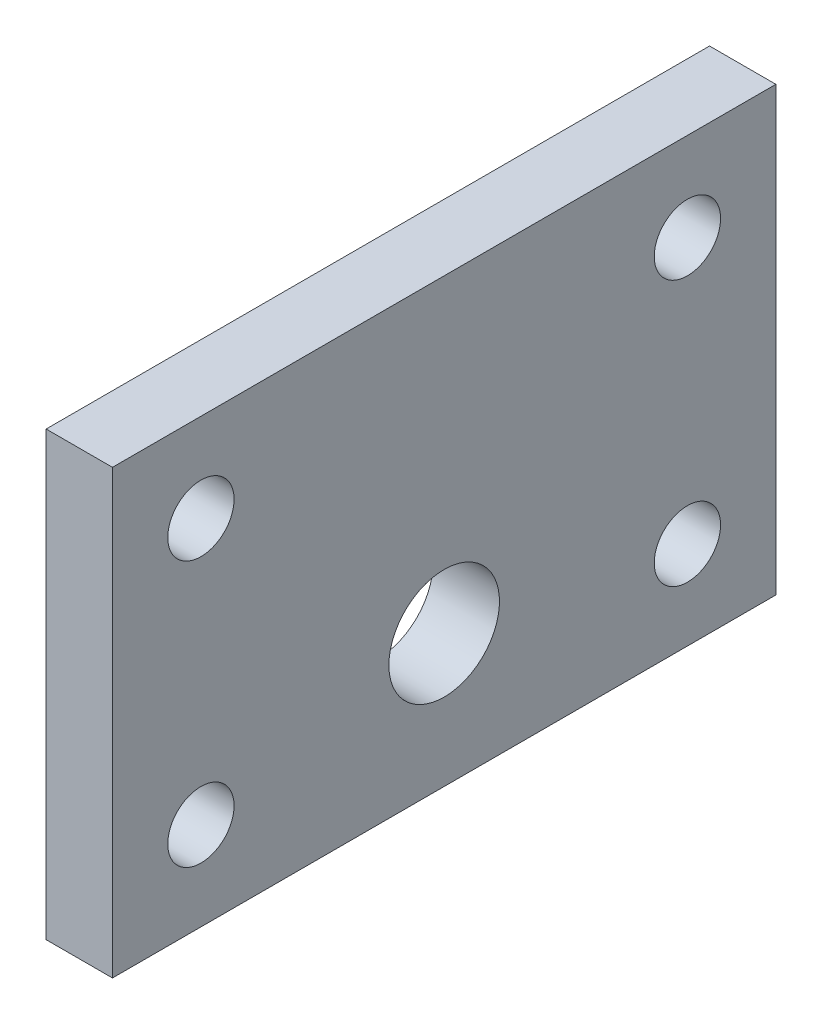
ISO-10303-21;
HEADER;
FILE_DESCRIPTION(('STEP AP214'),'2;1');
FILE_NAME('part.step','',(''),(''),'','','');
FILE_SCHEMA(('AUTOMOTIVE_DESIGN { 1 0 10303 214 1 1 1 1 }'));
ENDSEC;
DATA;
#1=APPLICATION_CONTEXT('core data for automotive mechanical design processes');
#2=APPLICATION_PROTOCOL_DEFINITION('international standard','automotive_design',2000,#1);
#3=PRODUCT_CONTEXT('',#1,'mechanical');
#4=PRODUCT('Part','Part','',(#3));
#5=PRODUCT_RELATED_PRODUCT_CATEGORY('part','',(#4));
#6=PRODUCT_DEFINITION_FORMATION('','',#4);
#7=PRODUCT_DEFINITION_CONTEXT('part definition',#1,'design');
#8=PRODUCT_DEFINITION('design','',#6,#7);
#9=PRODUCT_DEFINITION_SHAPE('','',#8);
#10=(LENGTH_UNIT() NAMED_UNIT(*) SI_UNIT(.MILLI.,.METRE.));
#11=(NAMED_UNIT(*) PLANE_ANGLE_UNIT() SI_UNIT($,.RADIAN.));
#12=(NAMED_UNIT(*) SI_UNIT($,.STERADIAN.) SOLID_ANGLE_UNIT());
#13=UNCERTAINTY_MEASURE_WITH_UNIT(LENGTH_MEASURE(1.E-05),#10,'distance_accuracy_value','');
#14=(GEOMETRIC_REPRESENTATION_CONTEXT(3) GLOBAL_UNCERTAINTY_ASSIGNED_CONTEXT((#13)) GLOBAL_UNIT_ASSIGNED_CONTEXT((#10,
#11,#12)) REPRESENTATION_CONTEXT('',''));
#15=CARTESIAN_POINT('',(0.,0.,0.));
#16=DIRECTION('',(0.,0.,1.));
#17=DIRECTION('',(1.,0.,0.));
#18=AXIS2_PLACEMENT_3D('',#15,#16,#17);
#19=CARTESIAN_POINT('',(3.,0.,0.));
#20=DIRECTION('',(1.,0.,0.));
#21=DIRECTION('',(0.,0.,-1.));
#22=AXIS2_PLACEMENT_3D('',#19,#20,#21);
#23=PLANE('',#22);
#24=CARTESIAN_POINT('',(3.,-4.,0.));
#25=DIRECTION('',(1.,0.,0.));
#26=DIRECTION('',(0.,0.,-1.));
#27=AXIS2_PLACEMENT_3D('',#24,#25,#26);
#28=CIRCLE('',#27,2.5);
#29=CARTESIAN_POINT('',(3.,-4.,2.5));
#30=VERTEX_POINT('',#29);
#31=EDGE_CURVE('E136',#30,#30,#28,.F.);
#32=ORIENTED_EDGE('',*,*,#31,.T.);
#33=EDGE_LOOP('',(#32));
#34=FACE_BOUND('',#33,.T.);
#35=CARTESIAN_POINT('',(3.,-6.,-11.));
#36=DIRECTION('',(1.,0.,0.));
#37=DIRECTION('',(0.,0.,1.));
#38=AXIS2_PLACEMENT_3D('',#35,#36,#37);
#39=CIRCLE('',#38,1.5);
#40=CARTESIAN_POINT('',(3.,-6.,-9.49999999999999));
#41=VERTEX_POINT('',#40);
#42=EDGE_CURVE('E121',#41,#41,#39,.T.);
#43=ORIENTED_EDGE('',*,*,#42,.F.);
#44=EDGE_LOOP('',(#43));
#45=FACE_BOUND('',#44,.T.);
#46=CARTESIAN_POINT('',(3.,6.,11.));
#47=DIRECTION('',(1.,0.,0.));
#48=DIRECTION('',(0.,0.,-1.));
#49=AXIS2_PLACEMENT_3D('',#46,#47,#48);
#50=CIRCLE('',#49,1.5);
#51=CARTESIAN_POINT('',(3.,6.,9.50000000000001));
#52=VERTEX_POINT('',#51);
#53=EDGE_CURVE('E100',#52,#52,#50,.T.);
#54=ORIENTED_EDGE('',*,*,#53,.F.);
#55=EDGE_LOOP('',(#54));
#56=FACE_BOUND('',#55,.T.);
#57=DIRECTION('',(0.,-1.,0.));
#58=VECTOR('',#57,1.);
#59=CARTESIAN_POINT('',(3.,-9.99999999999999,15.));
#60=LINE('',#59,#58);
#61=CARTESIAN_POINT('',(3.,9.99999999999999,15.));
#62=VERTEX_POINT('',#61);
#63=CARTESIAN_POINT('',(3.,-9.99999999999999,15.));
#64=VERTEX_POINT('',#63);
#65=EDGE_CURVE('E85',#62,#64,#60,.T.);
#66=ORIENTED_EDGE('',*,*,#65,.T.);
#67=DIRECTION('',(0.,0.,-1.));
#68=VECTOR('',#67,1.);
#69=CARTESIAN_POINT('',(3.,-10.,-15.));
#70=LINE('',#69,#68);
#71=CARTESIAN_POINT('',(3.,-10.,-15.));
#72=VERTEX_POINT('',#71);
#73=EDGE_CURVE('E80',#64,#72,#70,.T.);
#74=ORIENTED_EDGE('',*,*,#73,.T.);
#75=DIRECTION('',(0.,1.,0.));
#76=VECTOR('',#75,1.);
#77=CARTESIAN_POINT('',(3.,-10.,-15.));
#78=LINE('',#77,#76);
#79=CARTESIAN_POINT('',(3.,10.,-15.));
#80=VERTEX_POINT('',#79);
#81=EDGE_CURVE('E83',#72,#80,#78,.T.);
#82=ORIENTED_EDGE('',*,*,#81,.T.);
#83=DIRECTION('',(0.,0.,1.));
#84=VECTOR('',#83,1.);
#85=CARTESIAN_POINT('',(3.,10.,-15.));
#86=LINE('',#85,#84);
#87=EDGE_CURVE('E50',#80,#62,#86,.T.);
#88=ORIENTED_EDGE('',*,*,#87,.T.);
#89=EDGE_LOOP('',(#66,#74,#82,#88));
#90=FACE_BOUND('',#89,.T.);
#91=CARTESIAN_POINT('',(3.,-6.,11.));
#92=DIRECTION('',(1.,0.,0.));
#93=DIRECTION('',(0.,0.,-1.));
#94=AXIS2_PLACEMENT_3D('',#91,#92,#93);
#95=CIRCLE('',#94,1.5);
#96=CARTESIAN_POINT('',(3.,-6.,9.50000000000002));
#97=VERTEX_POINT('',#96);
#98=EDGE_CURVE('E115',#97,#97,#95,.T.);
#99=ORIENTED_EDGE('',*,*,#98,.F.);
#100=EDGE_LOOP('',(#99));
#101=FACE_BOUND('',#100,.T.);
#102=CARTESIAN_POINT('',(3.,6.,-11.));
#103=DIRECTION('',(1.,0.,0.));
#104=DIRECTION('',(0.,0.,1.));
#105=AXIS2_PLACEMENT_3D('',#102,#103,#104);
#106=CIRCLE('',#105,1.5);
#107=CARTESIAN_POINT('',(3.,6.,-9.49999999999998));
#108=VERTEX_POINT('',#107);
#109=EDGE_CURVE('E127',#108,#108,#106,.T.);
#110=ORIENTED_EDGE('',*,*,#109,.F.);
#111=EDGE_LOOP('',(#110));
#112=FACE_BOUND('',#111,.T.);
#113=ADVANCED_FACE('F33',(#34,#45,#56,#90,#101,#112),#23,.T.);
#114=CARTESIAN_POINT('',(0.,0.,0.));
#115=DIRECTION('',(1.,0.,0.));
#116=DIRECTION('',(0.,0.,-1.));
#117=AXIS2_PLACEMENT_3D('',#114,#115,#116);
#118=PLANE('',#117);
#119=CARTESIAN_POINT('',(0.,-4.,0.));
#120=DIRECTION('',(-1.,0.,0.));
#121=DIRECTION('',(0.,0.,1.));
#122=AXIS2_PLACEMENT_3D('',#119,#120,#121);
#123=CIRCLE('',#122,2.5);
#124=CARTESIAN_POINT('',(0.,-4.,2.5));
#125=VERTEX_POINT('',#124);
#126=EDGE_CURVE('E133',#125,#125,#123,.T.);
#127=ORIENTED_EDGE('',*,*,#126,.F.);
#128=EDGE_LOOP('',(#127));
#129=FACE_BOUND('',#128,.T.);
#130=DIRECTION('',(0.,-1.,0.));
#131=VECTOR('',#130,1.);
#132=CARTESIAN_POINT('',(0.,-9.99999999999999,15.));
#133=LINE('',#132,#131);
#134=CARTESIAN_POINT('',(0.,9.99999999999999,15.));
#135=VERTEX_POINT('',#134);
#136=CARTESIAN_POINT('',(0.,-9.99999999999999,15.));
#137=VERTEX_POINT('',#136);
#138=EDGE_CURVE('E97',#135,#137,#133,.T.);
#139=ORIENTED_EDGE('',*,*,#138,.F.);
#140=DIRECTION('',(0.,0.,1.));
#141=VECTOR('',#140,1.);
#142=CARTESIAN_POINT('',(0.,10.,-15.));
#143=LINE('',#142,#141);
#144=CARTESIAN_POINT('',(0.,10.,-15.));
#145=VERTEX_POINT('',#144);
#146=EDGE_CURVE('E73',#145,#135,#143,.T.);
#147=ORIENTED_EDGE('',*,*,#146,.F.);
#148=DIRECTION('',(0.,1.,0.));
#149=VECTOR('',#148,1.);
#150=CARTESIAN_POINT('',(0.,-10.,-15.));
#151=LINE('',#150,#149);
#152=CARTESIAN_POINT('',(0.,-10.,-15.));
#153=VERTEX_POINT('',#152);
#154=EDGE_CURVE('E67',#153,#145,#151,.T.);
#155=ORIENTED_EDGE('',*,*,#154,.F.);
#156=DIRECTION('',(0.,0.,-1.));
#157=VECTOR('',#156,1.);
#158=CARTESIAN_POINT('',(0.,-10.,-15.));
#159=LINE('',#158,#157);
#160=EDGE_CURVE('E89',#137,#153,#159,.T.);
#161=ORIENTED_EDGE('',*,*,#160,.F.);
#162=EDGE_LOOP('',(#139,#147,#155,#161));
#163=FACE_BOUND('',#162,.T.);
#164=CARTESIAN_POINT('',(0.,6.,11.));
#165=DIRECTION('',(1.,0.,0.));
#166=DIRECTION('',(0.,0.,-1.));
#167=AXIS2_PLACEMENT_3D('',#164,#165,#166);
#168=CIRCLE('',#167,1.5);
#169=CARTESIAN_POINT('',(0.,6.,9.50000000000001));
#170=VERTEX_POINT('',#169);
#171=EDGE_CURVE('E112',#170,#170,#168,.T.);
#172=ORIENTED_EDGE('',*,*,#171,.T.);
#173=EDGE_LOOP('',(#172));
#174=FACE_BOUND('',#173,.T.);
#175=CARTESIAN_POINT('',(0.,-6.,11.));
#176=DIRECTION('',(1.,0.,0.));
#177=DIRECTION('',(0.,0.,-1.));
#178=AXIS2_PLACEMENT_3D('',#175,#176,#177);
#179=CIRCLE('',#178,1.5);
#180=CARTESIAN_POINT('',(0.,-6.,9.50000000000002));
#181=VERTEX_POINT('',#180);
#182=EDGE_CURVE('E118',#181,#181,#179,.T.);
#183=ORIENTED_EDGE('',*,*,#182,.T.);
#184=EDGE_LOOP('',(#183));
#185=FACE_BOUND('',#184,.T.);
#186=CARTESIAN_POINT('',(0.,-6.,-11.));
#187=DIRECTION('',(1.,0.,0.));
#188=DIRECTION('',(0.,0.,1.));
#189=AXIS2_PLACEMENT_3D('',#186,#187,#188);
#190=CIRCLE('',#189,1.5);
#191=CARTESIAN_POINT('',(0.,-6.,-9.49999999999999));
#192=VERTEX_POINT('',#191);
#193=EDGE_CURVE('E124',#192,#192,#190,.T.);
#194=ORIENTED_EDGE('',*,*,#193,.T.);
#195=EDGE_LOOP('',(#194));
#196=FACE_BOUND('',#195,.T.);
#197=CARTESIAN_POINT('',(0.,6.,-11.));
#198=DIRECTION('',(1.,0.,0.));
#199=DIRECTION('',(0.,0.,1.));
#200=AXIS2_PLACEMENT_3D('',#197,#198,#199);
#201=CIRCLE('',#200,1.5);
#202=CARTESIAN_POINT('',(0.,6.,-9.49999999999998));
#203=VERTEX_POINT('',#202);
#204=EDGE_CURVE('E130',#203,#203,#201,.T.);
#205=ORIENTED_EDGE('',*,*,#204,.T.);
#206=EDGE_LOOP('',(#205));
#207=FACE_BOUND('',#206,.T.);
#208=ADVANCED_FACE('F108',(#129,#163,#174,#185,#196,#207),#118,.F.);
#209=CARTESIAN_POINT('',(3.,-9.99999999999999,15.));
#210=DIRECTION('',(0.,0.,-1.));
#211=DIRECTION('',(-1.,0.,0.));
#212=AXIS2_PLACEMENT_3D('',#209,#210,#211);
#213=PLANE('',#212);
#214=ORIENTED_EDGE('',*,*,#138,.T.);
#215=DIRECTION('',(-1.,0.,0.));
#216=VECTOR('',#215,1.);
#217=CARTESIAN_POINT('',(3.,-9.99999999999999,15.));
#218=LINE('',#217,#216);
#219=EDGE_CURVE('E11',#64,#137,#218,.T.);
#220=ORIENTED_EDGE('',*,*,#219,.F.);
#221=ORIENTED_EDGE('',*,*,#65,.F.);
#222=DIRECTION('',(-1.,0.,0.));
#223=VECTOR('',#222,1.);
#224=CARTESIAN_POINT('',(3.,9.99999999999999,15.));
#225=LINE('',#224,#223);
#226=EDGE_CURVE('E93',#62,#135,#225,.T.);
#227=ORIENTED_EDGE('',*,*,#226,.T.);
#228=EDGE_LOOP('',(#214,#220,#221,#227));
#229=FACE_BOUND('',#228,.T.);
#230=ADVANCED_FACE('F35',(#229),#213,.F.);
#231=CARTESIAN_POINT('',(3.,-10.,-15.));
#232=DIRECTION('',(0.,1.,0.));
#233=DIRECTION('',(0.,0.,1.));
#234=AXIS2_PLACEMENT_3D('',#231,#232,#233);
#235=PLANE('',#234);
#236=ORIENTED_EDGE('',*,*,#160,.T.);
#237=DIRECTION('',(-1.,0.,0.));
#238=VECTOR('',#237,1.);
#239=CARTESIAN_POINT('',(3.,-10.,-15.));
#240=LINE('',#239,#238);
#241=EDGE_CURVE('E42',#72,#153,#240,.T.);
#242=ORIENTED_EDGE('',*,*,#241,.F.);
#243=ORIENTED_EDGE('',*,*,#73,.F.);
#244=ORIENTED_EDGE('',*,*,#219,.T.);
#245=EDGE_LOOP('',(#236,#242,#243,#244));
#246=FACE_BOUND('',#245,.T.);
#247=ADVANCED_FACE('F88',(#246),#235,.F.);
#248=CARTESIAN_POINT('',(3.,-10.,-15.));
#249=DIRECTION('',(0.,0.,1.));
#250=DIRECTION('',(1.,0.,0.));
#251=AXIS2_PLACEMENT_3D('',#248,#249,#250);
#252=PLANE('',#251);
#253=ORIENTED_EDGE('',*,*,#154,.T.);
#254=DIRECTION('',(-1.,0.,0.));
#255=VECTOR('',#254,1.);
#256=CARTESIAN_POINT('',(3.,10.,-15.));
#257=LINE('',#256,#255);
#258=EDGE_CURVE('E90',#80,#145,#257,.T.);
#259=ORIENTED_EDGE('',*,*,#258,.F.);
#260=ORIENTED_EDGE('',*,*,#81,.F.);
#261=ORIENTED_EDGE('',*,*,#241,.T.);
#262=EDGE_LOOP('',(#253,#259,#260,#261));
#263=FACE_BOUND('',#262,.T.);
#264=ADVANCED_FACE('F91',(#263),#252,.F.);
#265=CARTESIAN_POINT('',(3.,10.,-15.));
#266=DIRECTION('',(0.,-1.,0.));
#267=DIRECTION('',(0.,0.,-1.));
#268=AXIS2_PLACEMENT_3D('',#265,#266,#267);
#269=PLANE('',#268);
#270=ORIENTED_EDGE('',*,*,#146,.T.);
#271=ORIENTED_EDGE('',*,*,#226,.F.);
#272=ORIENTED_EDGE('',*,*,#87,.F.);
#273=ORIENTED_EDGE('',*,*,#258,.T.);
#274=EDGE_LOOP('',(#270,#271,#272,#273));
#275=FACE_BOUND('',#274,.T.);
#276=ADVANCED_FACE('F105',(#275),#269,.F.);
#277=CARTESIAN_POINT('',(3.,6.,11.));
#278=DIRECTION('',(-1.,0.,0.));
#279=DIRECTION('',(0.,0.,1.));
#280=AXIS2_PLACEMENT_3D('',#277,#278,#279);
#281=CYLINDRICAL_SURFACE('',#280,1.5);
#282=ORIENTED_EDGE('',*,*,#53,.T.);
#283=EDGE_LOOP('',(#282));
#284=FACE_BOUND('',#283,.T.);
#285=ORIENTED_EDGE('',*,*,#171,.F.);
#286=EDGE_LOOP('',(#285));
#287=FACE_BOUND('',#286,.T.);
#288=ADVANCED_FACE('F156',(#284,#287),#281,.F.);
#289=CARTESIAN_POINT('',(3.,-6.,11.));
#290=DIRECTION('',(-1.,0.,0.));
#291=DIRECTION('',(0.,0.,1.));
#292=AXIS2_PLACEMENT_3D('',#289,#290,#291);
#293=CYLINDRICAL_SURFACE('',#292,1.5);
#294=ORIENTED_EDGE('',*,*,#98,.T.);
#295=EDGE_LOOP('',(#294));
#296=FACE_BOUND('',#295,.T.);
#297=ORIENTED_EDGE('',*,*,#182,.F.);
#298=EDGE_LOOP('',(#297));
#299=FACE_BOUND('',#298,.T.);
#300=ADVANCED_FACE('F177',(#296,#299),#293,.F.);
#301=CARTESIAN_POINT('',(3.,-6.,-11.));
#302=DIRECTION('',(-1.,0.,0.));
#303=DIRECTION('',(0.,0.,1.));
#304=AXIS2_PLACEMENT_3D('',#301,#302,#303);
#305=CYLINDRICAL_SURFACE('',#304,1.5);
#306=ORIENTED_EDGE('',*,*,#42,.T.);
#307=EDGE_LOOP('',(#306));
#308=FACE_BOUND('',#307,.T.);
#309=ORIENTED_EDGE('',*,*,#193,.F.);
#310=EDGE_LOOP('',(#309));
#311=FACE_BOUND('',#310,.T.);
#312=ADVANCED_FACE('F184',(#308,#311),#305,.F.);
#313=CARTESIAN_POINT('',(3.,6.,-11.));
#314=DIRECTION('',(-1.,0.,0.));
#315=DIRECTION('',(0.,0.,1.));
#316=AXIS2_PLACEMENT_3D('',#313,#314,#315);
#317=CYLINDRICAL_SURFACE('',#316,1.5);
#318=ORIENTED_EDGE('',*,*,#109,.T.);
#319=EDGE_LOOP('',(#318));
#320=FACE_BOUND('',#319,.T.);
#321=ORIENTED_EDGE('',*,*,#204,.F.);
#322=EDGE_LOOP('',(#321));
#323=FACE_BOUND('',#322,.T.);
#324=ADVANCED_FACE('F192',(#320,#323),#317,.F.);
#325=CARTESIAN_POINT('',(3.001,-4.,0.));
#326=DIRECTION('',(-1.,0.,0.));
#327=DIRECTION('',(0.,0.,1.));
#328=AXIS2_PLACEMENT_3D('',#325,#326,#327);
#329=CYLINDRICAL_SURFACE('',#328,2.5);
#330=CARTESIAN_POINT('',(3.,-4.,2.5));
#331=CARTESIAN_POINT('',(2.96875,-4.,2.5));
#332=CARTESIAN_POINT('',(2.9375,-4.,2.5));
#333=CARTESIAN_POINT('',(2.875,-4.,2.5));
#334=CARTESIAN_POINT('',(2.84375,-4.,2.5));
#335=CARTESIAN_POINT('',(2.78125,-4.,2.5));
#336=CARTESIAN_POINT('',(2.75,-4.,2.5));
#337=CARTESIAN_POINT('',(2.6875,-4.,2.5));
#338=CARTESIAN_POINT('',(2.65625,-4.,2.5));
#339=CARTESIAN_POINT('',(2.59375,-4.,2.5));
#340=CARTESIAN_POINT('',(2.5625,-4.,2.5));
#341=CARTESIAN_POINT('',(2.5,-4.,2.5));
#342=CARTESIAN_POINT('',(2.46875,-4.,2.5));
#343=CARTESIAN_POINT('',(2.40625,-4.,2.5));
#344=CARTESIAN_POINT('',(2.375,-4.,2.5));
#345=CARTESIAN_POINT('',(2.3125,-4.,2.5));
#346=CARTESIAN_POINT('',(2.28125,-4.,2.5));
#347=CARTESIAN_POINT('',(2.21875,-4.,2.5));
#348=CARTESIAN_POINT('',(2.1875,-4.,2.5));
#349=CARTESIAN_POINT('',(2.125,-4.,2.5));
#350=CARTESIAN_POINT('',(2.09375,-4.,2.5));
#351=CARTESIAN_POINT('',(2.03125,-4.,2.5));
#352=CARTESIAN_POINT('',(2.,-4.,2.5));
#353=CARTESIAN_POINT('',(1.9375,-4.,2.5));
#354=CARTESIAN_POINT('',(1.90625,-4.,2.5));
#355=CARTESIAN_POINT('',(1.84375,-4.,2.5));
#356=CARTESIAN_POINT('',(1.8125,-4.,2.5));
#357=CARTESIAN_POINT('',(1.75,-4.,2.5));
#358=CARTESIAN_POINT('',(1.71875,-4.,2.5));
#359=CARTESIAN_POINT('',(1.65625,-4.,2.5));
#360=CARTESIAN_POINT('',(1.625,-4.,2.5));
#361=CARTESIAN_POINT('',(1.5625,-4.,2.5));
#362=CARTESIAN_POINT('',(1.53125,-4.,2.5));
#363=CARTESIAN_POINT('',(1.46875,-4.,2.5));
#364=CARTESIAN_POINT('',(1.4375,-4.,2.5));
#365=CARTESIAN_POINT('',(1.375,-4.,2.5));
#366=CARTESIAN_POINT('',(1.34375,-4.,2.5));
#367=CARTESIAN_POINT('',(1.28125,-4.,2.5));
#368=CARTESIAN_POINT('',(1.25,-4.,2.5));
#369=CARTESIAN_POINT('',(1.1875,-4.,2.5));
#370=CARTESIAN_POINT('',(1.15625,-4.,2.5));
#371=CARTESIAN_POINT('',(1.09375,-4.,2.5));
#372=CARTESIAN_POINT('',(1.0625,-4.,2.5));
#373=CARTESIAN_POINT('',(1.,-4.,2.5));
#374=CARTESIAN_POINT('',(0.96875,-4.,2.5));
#375=CARTESIAN_POINT('',(0.90625,-4.,2.5));
#376=CARTESIAN_POINT('',(0.875,-4.,2.5));
#377=CARTESIAN_POINT('',(0.8125,-4.,2.5));
#378=CARTESIAN_POINT('',(0.78125,-4.,2.5));
#379=CARTESIAN_POINT('',(0.71875,-4.,2.5));
#380=CARTESIAN_POINT('',(0.6875,-4.,2.5));
#381=CARTESIAN_POINT('',(0.625,-4.,2.5));
#382=CARTESIAN_POINT('',(0.59375,-4.,2.5));
#383=CARTESIAN_POINT('',(0.53125,-4.,2.5));
#384=CARTESIAN_POINT('',(0.5,-4.,2.5));
#385=CARTESIAN_POINT('',(0.4375,-4.,2.5));
#386=CARTESIAN_POINT('',(0.40625,-4.,2.5));
#387=CARTESIAN_POINT('',(0.34375,-4.,2.5));
#388=CARTESIAN_POINT('',(0.3125,-4.,2.5));
#389=CARTESIAN_POINT('',(0.25,-4.,2.5));
#390=CARTESIAN_POINT('',(0.21875,-4.,2.5));
#391=CARTESIAN_POINT('',(0.156250000000001,-4.,2.5));
#392=CARTESIAN_POINT('',(0.125000000000001,-4.,2.5));
#393=CARTESIAN_POINT('',(0.0625000000000005,-4.,2.5));
#394=CARTESIAN_POINT('',(0.0312500000000005,-4.,2.5));
#395=CARTESIAN_POINT('',(0.,-4.,2.5));
#396=B_SPLINE_CURVE_WITH_KNOTS('',3,(#330,#331,#332,#333,#334,#335,#336,#337,#338,#339,#340,
#341,#342,#343,#344,#345,#346,#347,#348,#349,#350,#351,#352,#353,#354,#355,#356,#357,#358,#359,
#360,#361,#362,#363,#364,#365,#366,#367,#368,#369,#370,#371,#372,#373,#374,#375,#376,#377,#378,
#379,#380,#381,#382,#383,#384,#385,#386,#387,#388,#389,#390,#391,#392,#393,#394,#395),
.UNSPECIFIED.,.F.,.F.,(4,2,2,2,2,2,2,2,2,2,2,2,2,2,2,2,2,2,2,2,2,2,2,2,2,2,2,2,2,2,2,2,4),(0.,
0.0937499999999997,0.1875,0.28125,0.375,0.46875,0.5625,0.65625,0.749999999999999,
0.843749999999999,0.9375,1.03125,1.125,1.21875,1.3125,1.40625,1.5,1.59375,1.6875,1.78125,1.875,
1.96875,2.0625,2.15625,2.25,2.34375,2.4375,2.53125,2.625,2.71875,2.8125,2.90625,3.),.UNSPECIFIED.);
#397=EDGE_CURVE('BSEAM142',#30,#125,#396,.T.);
#398=ORIENTED_EDGE('',*,*,#31,.F.);
#399=ORIENTED_EDGE('',*,*,#126,.T.);
#400=ORIENTED_EDGE('',*,*,#397,.T.);
#401=ORIENTED_EDGE('',*,*,#397,.F.);
#402=EDGE_LOOP('',(#398,#400,#399,#401));
#403=FACE_BOUND('',#402,.T.);
#404=ADVANCED_FACE('F142',(#403),#329,.F.);
#405=CLOSED_SHELL('',(#113,#208,#230,#247,#264,#276,#288,#300,#312,#324,#404));
#406=MANIFOLD_SOLID_BREP('B2',#405);
#407=ADVANCED_BREP_SHAPE_REPRESENTATION('',(#18,#406),#14);
#408=SHAPE_DEFINITION_REPRESENTATION(#9,#407);
ENDSEC;
END-ISO-10303-21;
